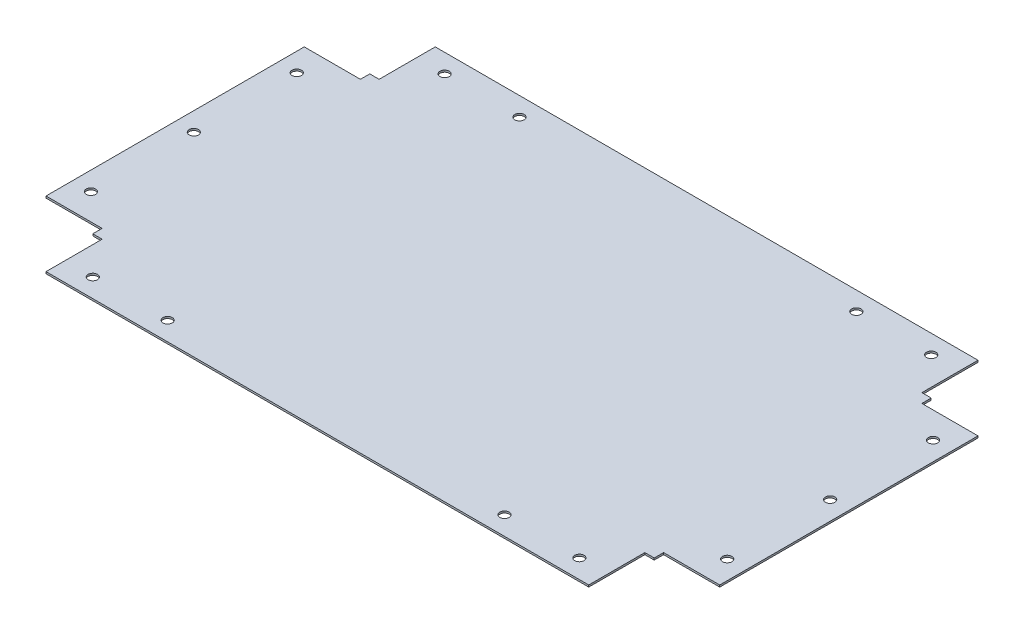
ISO-10303-21;
HEADER;
FILE_DESCRIPTION(('STEP AP214'),'2;1');
FILE_NAME('part.step','',(''),(''),'','','');
FILE_SCHEMA(('AUTOMOTIVE_DESIGN { 1 0 10303 214 1 1 1 1 }'));
ENDSEC;
DATA;
#1=APPLICATION_CONTEXT('core data for automotive mechanical design processes');
#2=APPLICATION_PROTOCOL_DEFINITION('international standard','automotive_design',2000,#1);
#3=PRODUCT_CONTEXT('',#1,'mechanical');
#4=PRODUCT('Part','Part','',(#3));
#5=PRODUCT_RELATED_PRODUCT_CATEGORY('part','',(#4));
#6=PRODUCT_DEFINITION_FORMATION('','',#4);
#7=PRODUCT_DEFINITION_CONTEXT('part definition',#1,'design');
#8=PRODUCT_DEFINITION('design','',#6,#7);
#9=PRODUCT_DEFINITION_SHAPE('','',#8);
#10=(LENGTH_UNIT() NAMED_UNIT(*) SI_UNIT(.MILLI.,.METRE.));
#11=(NAMED_UNIT(*) PLANE_ANGLE_UNIT() SI_UNIT($,.RADIAN.));
#12=(NAMED_UNIT(*) SI_UNIT($,.STERADIAN.) SOLID_ANGLE_UNIT());
#13=UNCERTAINTY_MEASURE_WITH_UNIT(LENGTH_MEASURE(1.E-05),#10,'distance_accuracy_value','');
#14=(GEOMETRIC_REPRESENTATION_CONTEXT(3) GLOBAL_UNCERTAINTY_ASSIGNED_CONTEXT((#13)) GLOBAL_UNIT_ASSIGNED_CONTEXT((#10,
#11,#12)) REPRESENTATION_CONTEXT('',''));
#15=CARTESIAN_POINT('',(0.,0.,0.));
#16=DIRECTION('',(0.,0.,1.));
#17=DIRECTION('',(1.,0.,0.));
#18=AXIS2_PLACEMENT_3D('',#15,#16,#17);
#19=CARTESIAN_POINT('',(0.,1.,0.));
#20=DIRECTION('',(0.,-1.,0.));
#21=DIRECTION('',(0.,0.,-1.));
#22=AXIS2_PLACEMENT_3D('',#19,#20,#21);
#23=PLANE('',#22);
#24=DIRECTION('',(1.,0.,0.));
#25=VECTOR('',#24,1.);
#26=CARTESIAN_POINT('',(5.,1.,0.));
#27=LINE('',#26,#25);
#28=CARTESIAN_POINT('',(0.,1.,0.));
#29=VERTEX_POINT('',#28);
#30=CARTESIAN_POINT('',(5.,1.,0.));
#31=VERTEX_POINT('',#30);
#32=EDGE_CURVE('E241',#29,#31,#27,.T.);
#33=ORIENTED_EDGE('',*,*,#32,.T.);
#34=DIRECTION('',(0.,0.,1.));
#35=VECTOR('',#34,1.);
#36=CARTESIAN_POINT('',(5.,1.,30.));
#37=LINE('',#36,#35);
#38=CARTESIAN_POINT('',(5.,1.,30.));
#39=VERTEX_POINT('',#38);
#40=EDGE_CURVE('E129',#31,#39,#37,.T.);
#41=ORIENTED_EDGE('',*,*,#40,.T.);
#42=DIRECTION('',(1.,0.,0.));
#43=VECTOR('',#42,1.);
#44=CARTESIAN_POINT('',(295.,1.,30.));
#45=LINE('',#44,#43);
#46=CARTESIAN_POINT('',(295.,1.,30.));
#47=VERTEX_POINT('',#46);
#48=EDGE_CURVE('E292',#39,#47,#45,.T.);
#49=ORIENTED_EDGE('',*,*,#48,.T.);
#50=DIRECTION('',(0.,0.,-1.));
#51=VECTOR('',#50,1.);
#52=CARTESIAN_POINT('',(295.,1.,0.));
#53=LINE('',#52,#51);
#54=CARTESIAN_POINT('',(295.,1.,0.));
#55=VERTEX_POINT('',#54);
#56=EDGE_CURVE('E311',#47,#55,#53,.T.);
#57=ORIENTED_EDGE('',*,*,#56,.T.);
#58=DIRECTION('',(1.,0.,0.));
#59=VECTOR('',#58,1.);
#60=CARTESIAN_POINT('',(300.,1.,0.));
#61=LINE('',#60,#59);
#62=CARTESIAN_POINT('',(300.,1.,0.));
#63=VERTEX_POINT('',#62);
#64=EDGE_CURVE('E308',#55,#63,#61,.T.);
#65=ORIENTED_EDGE('',*,*,#64,.T.);
#66=DIRECTION('',(0.,0.,-1.));
#67=VECTOR('',#66,1.);
#68=CARTESIAN_POINT('',(300.,1.,-5.));
#69=LINE('',#68,#67);
#70=CARTESIAN_POINT('',(300.,1.,-5.));
#71=VERTEX_POINT('',#70);
#72=EDGE_CURVE('E310',#63,#71,#69,.T.);
#73=ORIENTED_EDGE('',*,*,#72,.T.);
#74=DIRECTION('',(1.,0.,0.));
#75=VECTOR('',#74,1.);
#76=CARTESIAN_POINT('',(330.,1.,-5.));
#77=LINE('',#76,#75);
#78=CARTESIAN_POINT('',(330.,1.,-5.));
#79=VERTEX_POINT('',#78);
#80=EDGE_CURVE('E313',#71,#79,#77,.T.);
#81=ORIENTED_EDGE('',*,*,#80,.T.);
#82=DIRECTION('',(0.,0.,-1.));
#83=VECTOR('',#82,1.);
#84=CARTESIAN_POINT('',(330.,1.,-143.));
#85=LINE('',#84,#83);
#86=CARTESIAN_POINT('',(330.,1.,-143.));
#87=VERTEX_POINT('',#86);
#88=EDGE_CURVE('E319',#79,#87,#85,.T.);
#89=ORIENTED_EDGE('',*,*,#88,.T.);
#90=DIRECTION('',(-1.,0.,0.));
#91=VECTOR('',#90,1.);
#92=CARTESIAN_POINT('',(300.,1.,-143.));
#93=LINE('',#92,#91);
#94=CARTESIAN_POINT('',(300.,1.,-143.));
#95=VERTEX_POINT('',#94);
#96=EDGE_CURVE('E321',#87,#95,#93,.T.);
#97=ORIENTED_EDGE('',*,*,#96,.T.);
#98=DIRECTION('',(0.,0.,-1.));
#99=VECTOR('',#98,1.);
#100=CARTESIAN_POINT('',(300.,1.,-148.));
#101=LINE('',#100,#99);
#102=CARTESIAN_POINT('',(300.,1.,-148.));
#103=VERTEX_POINT('',#102);
#104=EDGE_CURVE('E323',#95,#103,#101,.T.);
#105=ORIENTED_EDGE('',*,*,#104,.T.);
#106=DIRECTION('',(-1.,0.,0.));
#107=VECTOR('',#106,1.);
#108=CARTESIAN_POINT('',(295.,1.,-148.));
#109=LINE('',#108,#107);
#110=CARTESIAN_POINT('',(295.,1.,-148.));
#111=VERTEX_POINT('',#110);
#112=EDGE_CURVE('E325',#103,#111,#109,.T.);
#113=ORIENTED_EDGE('',*,*,#112,.T.);
#114=DIRECTION('',(0.,0.,-1.));
#115=VECTOR('',#114,1.);
#116=CARTESIAN_POINT('',(295.,1.,-178.));
#117=LINE('',#116,#115);
#118=CARTESIAN_POINT('',(295.,1.,-178.));
#119=VERTEX_POINT('',#118);
#120=EDGE_CURVE('E327',#111,#119,#117,.T.);
#121=ORIENTED_EDGE('',*,*,#120,.T.);
#122=DIRECTION('',(-1.,0.,0.));
#123=VECTOR('',#122,1.);
#124=CARTESIAN_POINT('',(5.,1.,-178.));
#125=LINE('',#124,#123);
#126=CARTESIAN_POINT('',(5.,1.,-178.));
#127=VERTEX_POINT('',#126);
#128=EDGE_CURVE('E329',#119,#127,#125,.T.);
#129=ORIENTED_EDGE('',*,*,#128,.T.);
#130=DIRECTION('',(0.,0.,1.));
#131=VECTOR('',#130,1.);
#132=CARTESIAN_POINT('',(5.,1.,-148.));
#133=LINE('',#132,#131);
#134=CARTESIAN_POINT('',(5.,1.,-148.));
#135=VERTEX_POINT('',#134);
#136=EDGE_CURVE('E331',#127,#135,#133,.T.);
#137=ORIENTED_EDGE('',*,*,#136,.T.);
#138=DIRECTION('',(-1.,0.,0.));
#139=VECTOR('',#138,1.);
#140=CARTESIAN_POINT('',(0.,1.,-148.));
#141=LINE('',#140,#139);
#142=CARTESIAN_POINT('',(0.,1.,-148.));
#143=VERTEX_POINT('',#142);
#144=EDGE_CURVE('E333',#135,#143,#141,.T.);
#145=ORIENTED_EDGE('',*,*,#144,.T.);
#146=DIRECTION('',(0.,0.,1.));
#147=VECTOR('',#146,1.);
#148=CARTESIAN_POINT('',(0.,1.,-143.));
#149=LINE('',#148,#147);
#150=CARTESIAN_POINT('',(0.,1.,-143.));
#151=VERTEX_POINT('',#150);
#152=EDGE_CURVE('E335',#143,#151,#149,.T.);
#153=ORIENTED_EDGE('',*,*,#152,.T.);
#154=DIRECTION('',(-1.,0.,0.));
#155=VECTOR('',#154,1.);
#156=CARTESIAN_POINT('',(-30.,1.,-143.));
#157=LINE('',#156,#155);
#158=CARTESIAN_POINT('',(-30.,1.,-143.));
#159=VERTEX_POINT('',#158);
#160=EDGE_CURVE('E184',#151,#159,#157,.T.);
#161=ORIENTED_EDGE('',*,*,#160,.T.);
#162=DIRECTION('',(0.,0.,1.));
#163=VECTOR('',#162,1.);
#164=CARTESIAN_POINT('',(-30.,1.,-5.));
#165=LINE('',#164,#163);
#166=CARTESIAN_POINT('',(-30.,1.,-5.));
#167=VERTEX_POINT('',#166);
#168=EDGE_CURVE('E178',#159,#167,#165,.T.);
#169=ORIENTED_EDGE('',*,*,#168,.T.);
#170=DIRECTION('',(1.,0.,0.));
#171=VECTOR('',#170,1.);
#172=CARTESIAN_POINT('',(0.,1.,-5.));
#173=LINE('',#172,#171);
#174=CARTESIAN_POINT('',(0.,1.,-5.));
#175=VERTEX_POINT('',#174);
#176=EDGE_CURVE('E182',#167,#175,#173,.T.);
#177=ORIENTED_EDGE('',*,*,#176,.T.);
#178=DIRECTION('',(0.,0.,1.));
#179=VECTOR('',#178,1.);
#180=CARTESIAN_POINT('',(0.,1.,0.));
#181=LINE('',#180,#179);
#182=EDGE_CURVE('E50',#175,#29,#181,.T.);
#183=ORIENTED_EDGE('',*,*,#182,.T.);
#184=EDGE_LOOP('',(#33,#41,#49,#57,#65,#73,#81,#89,#97,#105,#113,#121,#129,#137,#145,#153,#161,
#169,#177,#183));
#185=FACE_BOUND('',#184,.T.);
#186=CARTESIAN_POINT('',(20.,1.,20.));
#187=DIRECTION('',(0.,1.,0.));
#188=DIRECTION('',(0.,0.,1.));
#189=AXIS2_PLACEMENT_3D('',#186,#187,#188);
#190=CIRCLE('',#189,2.5);
#191=CARTESIAN_POINT('',(20.,1.,22.5));
#192=VERTEX_POINT('',#191);
#193=EDGE_CURVE('E206',#192,#192,#190,.T.);
#194=ORIENTED_EDGE('',*,*,#193,.F.);
#195=EDGE_LOOP('',(#194));
#196=FACE_BOUND('',#195,.T.);
#197=CARTESIAN_POINT('',(60.,1.,20.));
#198=DIRECTION('',(0.,1.,0.));
#199=DIRECTION('',(0.,0.,1.));
#200=AXIS2_PLACEMENT_3D('',#197,#198,#199);
#201=CIRCLE('',#200,2.5);
#202=CARTESIAN_POINT('',(60.,1.,22.5));
#203=VERTEX_POINT('',#202);
#204=EDGE_CURVE('E499',#203,#203,#201,.T.);
#205=ORIENTED_EDGE('',*,*,#204,.F.);
#206=EDGE_LOOP('',(#205));
#207=FACE_BOUND('',#206,.T.);
#208=CARTESIAN_POINT('',(280.,1.,20.));
#209=DIRECTION('',(0.,1.,0.));
#210=DIRECTION('',(0.,0.,1.));
#211=AXIS2_PLACEMENT_3D('',#208,#209,#210);
#212=CIRCLE('',#211,2.50000000000002);
#213=CARTESIAN_POINT('',(280.,1.,22.5));
#214=VERTEX_POINT('',#213);
#215=EDGE_CURVE('E493',#214,#214,#212,.T.);
#216=ORIENTED_EDGE('',*,*,#215,.F.);
#217=EDGE_LOOP('',(#216));
#218=FACE_BOUND('',#217,.T.);
#219=CARTESIAN_POINT('',(240.,1.,20.));
#220=DIRECTION('',(0.,1.,0.));
#221=DIRECTION('',(0.,0.,1.));
#222=AXIS2_PLACEMENT_3D('',#219,#220,#221);
#223=CIRCLE('',#222,2.5);
#224=CARTESIAN_POINT('',(240.,1.,22.5));
#225=VERTEX_POINT('',#224);
#226=EDGE_CURVE('E487',#225,#225,#223,.T.);
#227=ORIENTED_EDGE('',*,*,#226,.F.);
#228=EDGE_LOOP('',(#227));
#229=FACE_BOUND('',#228,.T.);
#230=CARTESIAN_POINT('',(320.,1.,-19.));
#231=DIRECTION('',(0.,1.,0.));
#232=DIRECTION('',(0.,0.,1.));
#233=AXIS2_PLACEMENT_3D('',#230,#231,#232);
#234=CIRCLE('',#233,2.50000000000002);
#235=CARTESIAN_POINT('',(320.,1.,-16.5));
#236=VERTEX_POINT('',#235);
#237=EDGE_CURVE('E481',#236,#236,#234,.T.);
#238=ORIENTED_EDGE('',*,*,#237,.F.);
#239=EDGE_LOOP('',(#238));
#240=FACE_BOUND('',#239,.T.);
#241=CARTESIAN_POINT('',(320.,1.,-129.));
#242=DIRECTION('',(0.,1.,0.));
#243=DIRECTION('',(0.,0.,1.));
#244=AXIS2_PLACEMENT_3D('',#241,#242,#243);
#245=CIRCLE('',#244,2.50000000000002);
#246=CARTESIAN_POINT('',(320.,1.,-126.5));
#247=VERTEX_POINT('',#246);
#248=EDGE_CURVE('E475',#247,#247,#245,.T.);
#249=ORIENTED_EDGE('',*,*,#248,.F.);
#250=EDGE_LOOP('',(#249));
#251=FACE_BOUND('',#250,.T.);
#252=CARTESIAN_POINT('',(280.,1.,-168.));
#253=DIRECTION('',(0.,1.,0.));
#254=DIRECTION('',(0.,0.,1.));
#255=AXIS2_PLACEMENT_3D('',#252,#253,#254);
#256=CIRCLE('',#255,2.50000000000002);
#257=CARTESIAN_POINT('',(280.,1.,-165.5));
#258=VERTEX_POINT('',#257);
#259=EDGE_CURVE('E469',#258,#258,#256,.T.);
#260=ORIENTED_EDGE('',*,*,#259,.F.);
#261=EDGE_LOOP('',(#260));
#262=FACE_BOUND('',#261,.T.);
#263=CARTESIAN_POINT('',(240.,1.,-168.));
#264=DIRECTION('',(0.,1.,0.));
#265=DIRECTION('',(0.,0.,1.));
#266=AXIS2_PLACEMENT_3D('',#263,#264,#265);
#267=CIRCLE('',#266,2.50000000000002);
#268=CARTESIAN_POINT('',(240.,1.,-165.5));
#269=VERTEX_POINT('',#268);
#270=EDGE_CURVE('E463',#269,#269,#267,.T.);
#271=ORIENTED_EDGE('',*,*,#270,.F.);
#272=EDGE_LOOP('',(#271));
#273=FACE_BOUND('',#272,.T.);
#274=CARTESIAN_POINT('',(60.,1.,-168.));
#275=DIRECTION('',(0.,1.,0.));
#276=DIRECTION('',(0.,0.,1.));
#277=AXIS2_PLACEMENT_3D('',#274,#275,#276);
#278=CIRCLE('',#277,2.5);
#279=CARTESIAN_POINT('',(60.,1.,-165.5));
#280=VERTEX_POINT('',#279);
#281=EDGE_CURVE('E457',#280,#280,#278,.T.);
#282=ORIENTED_EDGE('',*,*,#281,.F.);
#283=EDGE_LOOP('',(#282));
#284=FACE_BOUND('',#283,.T.);
#285=CARTESIAN_POINT('',(20.,1.,-168.));
#286=DIRECTION('',(0.,1.,0.));
#287=DIRECTION('',(0.,0.,1.));
#288=AXIS2_PLACEMENT_3D('',#285,#286,#287);
#289=CIRCLE('',#288,2.5);
#290=CARTESIAN_POINT('',(20.,1.,-165.5));
#291=VERTEX_POINT('',#290);
#292=EDGE_CURVE('E451',#291,#291,#289,.T.);
#293=ORIENTED_EDGE('',*,*,#292,.F.);
#294=EDGE_LOOP('',(#293));
#295=FACE_BOUND('',#294,.T.);
#296=CARTESIAN_POINT('',(-20.,1.,-129.));
#297=DIRECTION('',(0.,1.,0.));
#298=DIRECTION('',(0.,0.,1.));
#299=AXIS2_PLACEMENT_3D('',#296,#297,#298);
#300=CIRCLE('',#299,2.5);
#301=CARTESIAN_POINT('',(-20.,1.,-126.5));
#302=VERTEX_POINT('',#301);
#303=EDGE_CURVE('E445',#302,#302,#300,.T.);
#304=ORIENTED_EDGE('',*,*,#303,.F.);
#305=EDGE_LOOP('',(#304));
#306=FACE_BOUND('',#305,.T.);
#307=CARTESIAN_POINT('',(-20.,1.,-19.));
#308=DIRECTION('',(0.,1.,0.));
#309=DIRECTION('',(0.,0.,1.));
#310=AXIS2_PLACEMENT_3D('',#307,#308,#309);
#311=CIRCLE('',#310,2.5);
#312=CARTESIAN_POINT('',(-20.,1.,-16.5));
#313=VERTEX_POINT('',#312);
#314=EDGE_CURVE('E439',#313,#313,#311,.T.);
#315=ORIENTED_EDGE('',*,*,#314,.F.);
#316=EDGE_LOOP('',(#315));
#317=FACE_BOUND('',#316,.T.);
#318=CARTESIAN_POINT('',(-20.,1.,-74.));
#319=DIRECTION('',(0.,1.,0.));
#320=DIRECTION('',(0.,0.,1.));
#321=AXIS2_PLACEMENT_3D('',#318,#319,#320);
#322=CIRCLE('',#321,2.5);
#323=CARTESIAN_POINT('',(-20.,1.,-71.5));
#324=VERTEX_POINT('',#323);
#325=EDGE_CURVE('E433',#324,#324,#322,.T.);
#326=ORIENTED_EDGE('',*,*,#325,.F.);
#327=EDGE_LOOP('',(#326));
#328=FACE_BOUND('',#327,.T.);
#329=CARTESIAN_POINT('',(320.,1.,-74.));
#330=DIRECTION('',(0.,1.,0.));
#331=DIRECTION('',(0.,0.,1.));
#332=AXIS2_PLACEMENT_3D('',#329,#330,#331);
#333=CIRCLE('',#332,2.50000000000002);
#334=CARTESIAN_POINT('',(320.,1.,-71.5));
#335=VERTEX_POINT('',#334);
#336=EDGE_CURVE('E424',#335,#335,#333,.T.);
#337=ORIENTED_EDGE('',*,*,#336,.F.);
#338=EDGE_LOOP('',(#337));
#339=FACE_BOUND('',#338,.T.);
#340=ADVANCED_FACE('F33',(#185,#196,#207,#218,#229,#240,#251,#262,#273,#284,#295,#306,#317,#328,
#339),#23,.F.);
#341=CARTESIAN_POINT('',(0.,0.,0.));
#342=DIRECTION('',(0.,-1.,0.));
#343=DIRECTION('',(0.,0.,-1.));
#344=AXIS2_PLACEMENT_3D('',#341,#342,#343);
#345=PLANE('',#344);
#346=CARTESIAN_POINT('',(-20.,0.,-74.));
#347=DIRECTION('',(0.,1.,0.));
#348=DIRECTION('',(0.,0.,1.));
#349=AXIS2_PLACEMENT_3D('',#346,#347,#348);
#350=CIRCLE('',#349,2.5);
#351=CARTESIAN_POINT('',(-20.,0.,-71.5));
#352=VERTEX_POINT('',#351);
#353=EDGE_CURVE('E430',#352,#352,#350,.T.);
#354=ORIENTED_EDGE('',*,*,#353,.T.);
#355=EDGE_LOOP('',(#354));
#356=FACE_BOUND('',#355,.T.);
#357=CARTESIAN_POINT('',(-20.,0.,-129.));
#358=DIRECTION('',(0.,1.,0.));
#359=DIRECTION('',(0.,0.,1.));
#360=AXIS2_PLACEMENT_3D('',#357,#358,#359);
#361=CIRCLE('',#360,2.5);
#362=CARTESIAN_POINT('',(-20.,0.,-126.5));
#363=VERTEX_POINT('',#362);
#364=EDGE_CURVE('E442',#363,#363,#361,.T.);
#365=ORIENTED_EDGE('',*,*,#364,.T.);
#366=EDGE_LOOP('',(#365));
#367=FACE_BOUND('',#366,.T.);
#368=CARTESIAN_POINT('',(60.,0.,-168.));
#369=DIRECTION('',(0.,1.,0.));
#370=DIRECTION('',(0.,0.,1.));
#371=AXIS2_PLACEMENT_3D('',#368,#369,#370);
#372=CIRCLE('',#371,2.5);
#373=CARTESIAN_POINT('',(60.,0.,-165.5));
#374=VERTEX_POINT('',#373);
#375=EDGE_CURVE('E454',#374,#374,#372,.T.);
#376=ORIENTED_EDGE('',*,*,#375,.T.);
#377=EDGE_LOOP('',(#376));
#378=FACE_BOUND('',#377,.T.);
#379=CARTESIAN_POINT('',(280.,0.,-168.));
#380=DIRECTION('',(0.,1.,0.));
#381=DIRECTION('',(0.,0.,1.));
#382=AXIS2_PLACEMENT_3D('',#379,#380,#381);
#383=CIRCLE('',#382,2.50000000000002);
#384=CARTESIAN_POINT('',(280.,0.,-165.5));
#385=VERTEX_POINT('',#384);
#386=EDGE_CURVE('E466',#385,#385,#383,.T.);
#387=ORIENTED_EDGE('',*,*,#386,.T.);
#388=EDGE_LOOP('',(#387));
#389=FACE_BOUND('',#388,.T.);
#390=CARTESIAN_POINT('',(320.,0.,-19.));
#391=DIRECTION('',(0.,1.,0.));
#392=DIRECTION('',(0.,0.,1.));
#393=AXIS2_PLACEMENT_3D('',#390,#391,#392);
#394=CIRCLE('',#393,2.50000000000002);
#395=CARTESIAN_POINT('',(320.,0.,-16.5));
#396=VERTEX_POINT('',#395);
#397=EDGE_CURVE('E478',#396,#396,#394,.T.);
#398=ORIENTED_EDGE('',*,*,#397,.T.);
#399=EDGE_LOOP('',(#398));
#400=FACE_BOUND('',#399,.T.);
#401=CARTESIAN_POINT('',(280.,0.,20.));
#402=DIRECTION('',(0.,1.,0.));
#403=DIRECTION('',(0.,0.,1.));
#404=AXIS2_PLACEMENT_3D('',#401,#402,#403);
#405=CIRCLE('',#404,2.50000000000002);
#406=CARTESIAN_POINT('',(280.,0.,22.5));
#407=VERTEX_POINT('',#406);
#408=EDGE_CURVE('E490',#407,#407,#405,.T.);
#409=ORIENTED_EDGE('',*,*,#408,.T.);
#410=EDGE_LOOP('',(#409));
#411=FACE_BOUND('',#410,.T.);
#412=CARTESIAN_POINT('',(20.,0.,20.));
#413=DIRECTION('',(0.,1.,0.));
#414=DIRECTION('',(0.,0.,1.));
#415=AXIS2_PLACEMENT_3D('',#412,#413,#414);
#416=CIRCLE('',#415,2.5);
#417=CARTESIAN_POINT('',(20.,0.,22.5));
#418=VERTEX_POINT('',#417);
#419=EDGE_CURVE('E502',#418,#418,#416,.T.);
#420=ORIENTED_EDGE('',*,*,#419,.T.);
#421=EDGE_LOOP('',(#420));
#422=FACE_BOUND('',#421,.T.);
#423=DIRECTION('',(1.,0.,0.));
#424=VECTOR('',#423,1.);
#425=CARTESIAN_POINT('',(5.,0.,0.));
#426=LINE('',#425,#424);
#427=CARTESIAN_POINT('',(0.,0.,0.));
#428=VERTEX_POINT('',#427);
#429=CARTESIAN_POINT('',(5.,0.,0.));
#430=VERTEX_POINT('',#429);
#431=EDGE_CURVE('E202',#428,#430,#426,.T.);
#432=ORIENTED_EDGE('',*,*,#431,.F.);
#433=DIRECTION('',(0.,0.,1.));
#434=VECTOR('',#433,1.);
#435=CARTESIAN_POINT('',(0.,0.,0.));
#436=LINE('',#435,#434);
#437=CARTESIAN_POINT('',(0.,0.,-5.));
#438=VERTEX_POINT('',#437);
#439=EDGE_CURVE('E121',#438,#428,#436,.T.);
#440=ORIENTED_EDGE('',*,*,#439,.F.);
#441=DIRECTION('',(1.,0.,0.));
#442=VECTOR('',#441,1.);
#443=CARTESIAN_POINT('',(0.,0.,-5.));
#444=LINE('',#443,#442);
#445=CARTESIAN_POINT('',(-30.,0.,-5.));
#446=VERTEX_POINT('',#445);
#447=EDGE_CURVE('E115',#446,#438,#444,.T.);
#448=ORIENTED_EDGE('',*,*,#447,.F.);
#449=DIRECTION('',(0.,0.,1.));
#450=VECTOR('',#449,1.);
#451=CARTESIAN_POINT('',(-30.,0.,-5.));
#452=LINE('',#451,#450);
#453=CARTESIAN_POINT('',(-30.,0.,-143.));
#454=VERTEX_POINT('',#453);
#455=EDGE_CURVE('E192',#454,#446,#452,.T.);
#456=ORIENTED_EDGE('',*,*,#455,.F.);
#457=DIRECTION('',(-1.,0.,0.));
#458=VECTOR('',#457,1.);
#459=CARTESIAN_POINT('',(-30.,0.,-143.));
#460=LINE('',#459,#458);
#461=CARTESIAN_POINT('',(0.,0.,-143.));
#462=VERTEX_POINT('',#461);
#463=EDGE_CURVE('E236',#462,#454,#460,.T.);
#464=ORIENTED_EDGE('',*,*,#463,.F.);
#465=DIRECTION('',(0.,0.,1.));
#466=VECTOR('',#465,1.);
#467=CARTESIAN_POINT('',(0.,0.,-143.));
#468=LINE('',#467,#466);
#469=CARTESIAN_POINT('',(0.,0.,-148.));
#470=VERTEX_POINT('',#469);
#471=EDGE_CURVE('E234',#470,#462,#468,.T.);
#472=ORIENTED_EDGE('',*,*,#471,.F.);
#473=DIRECTION('',(-1.,0.,0.));
#474=VECTOR('',#473,1.);
#475=CARTESIAN_POINT('',(0.,0.,-148.));
#476=LINE('',#475,#474);
#477=CARTESIAN_POINT('',(5.,0.,-148.));
#478=VERTEX_POINT('',#477);
#479=EDGE_CURVE('E232',#478,#470,#476,.T.);
#480=ORIENTED_EDGE('',*,*,#479,.F.);
#481=DIRECTION('',(0.,0.,1.));
#482=VECTOR('',#481,1.);
#483=CARTESIAN_POINT('',(5.,0.,-148.));
#484=LINE('',#483,#482);
#485=CARTESIAN_POINT('',(5.,0.,-178.));
#486=VERTEX_POINT('',#485);
#487=EDGE_CURVE('E230',#486,#478,#484,.T.);
#488=ORIENTED_EDGE('',*,*,#487,.F.);
#489=DIRECTION('',(-1.,0.,0.));
#490=VECTOR('',#489,1.);
#491=CARTESIAN_POINT('',(5.,0.,-178.));
#492=LINE('',#491,#490);
#493=CARTESIAN_POINT('',(295.,0.,-178.));
#494=VERTEX_POINT('',#493);
#495=EDGE_CURVE('E228',#494,#486,#492,.T.);
#496=ORIENTED_EDGE('',*,*,#495,.F.);
#497=DIRECTION('',(0.,0.,-1.));
#498=VECTOR('',#497,1.);
#499=CARTESIAN_POINT('',(295.,0.,-178.));
#500=LINE('',#499,#498);
#501=CARTESIAN_POINT('',(295.,0.,-148.));
#502=VERTEX_POINT('',#501);
#503=EDGE_CURVE('E226',#502,#494,#500,.T.);
#504=ORIENTED_EDGE('',*,*,#503,.F.);
#505=DIRECTION('',(-1.,0.,0.));
#506=VECTOR('',#505,1.);
#507=CARTESIAN_POINT('',(295.,0.,-148.));
#508=LINE('',#507,#506);
#509=CARTESIAN_POINT('',(300.,0.,-148.));
#510=VERTEX_POINT('',#509);
#511=EDGE_CURVE('E224',#510,#502,#508,.T.);
#512=ORIENTED_EDGE('',*,*,#511,.F.);
#513=DIRECTION('',(0.,0.,-1.));
#514=VECTOR('',#513,1.);
#515=CARTESIAN_POINT('',(300.,0.,-148.));
#516=LINE('',#515,#514);
#517=CARTESIAN_POINT('',(300.,0.,-143.));
#518=VERTEX_POINT('',#517);
#519=EDGE_CURVE('E222',#518,#510,#516,.T.);
#520=ORIENTED_EDGE('',*,*,#519,.F.);
#521=DIRECTION('',(-1.,0.,0.));
#522=VECTOR('',#521,1.);
#523=CARTESIAN_POINT('',(300.,0.,-143.));
#524=LINE('',#523,#522);
#525=CARTESIAN_POINT('',(330.,0.,-143.));
#526=VERTEX_POINT('',#525);
#527=EDGE_CURVE('E220',#526,#518,#524,.T.);
#528=ORIENTED_EDGE('',*,*,#527,.F.);
#529=DIRECTION('',(0.,0.,-1.));
#530=VECTOR('',#529,1.);
#531=CARTESIAN_POINT('',(330.,0.,-143.));
#532=LINE('',#531,#530);
#533=CARTESIAN_POINT('',(330.,0.,-5.));
#534=VERTEX_POINT('',#533);
#535=EDGE_CURVE('E218',#534,#526,#532,.T.);
#536=ORIENTED_EDGE('',*,*,#535,.F.);
#537=DIRECTION('',(1.,0.,0.));
#538=VECTOR('',#537,1.);
#539=CARTESIAN_POINT('',(330.,0.,-5.));
#540=LINE('',#539,#538);
#541=CARTESIAN_POINT('',(300.,0.,-5.));
#542=VERTEX_POINT('',#541);
#543=EDGE_CURVE('E216',#542,#534,#540,.T.);
#544=ORIENTED_EDGE('',*,*,#543,.F.);
#545=DIRECTION('',(0.,0.,-1.));
#546=VECTOR('',#545,1.);
#547=CARTESIAN_POINT('',(300.,0.,-5.));
#548=LINE('',#547,#546);
#549=CARTESIAN_POINT('',(300.,0.,0.));
#550=VERTEX_POINT('',#549);
#551=EDGE_CURVE('E214',#550,#542,#548,.T.);
#552=ORIENTED_EDGE('',*,*,#551,.F.);
#553=DIRECTION('',(1.,0.,0.));
#554=VECTOR('',#553,1.);
#555=CARTESIAN_POINT('',(300.,0.,0.));
#556=LINE('',#555,#554);
#557=CARTESIAN_POINT('',(295.,0.,0.));
#558=VERTEX_POINT('',#557);
#559=EDGE_CURVE('E212',#558,#550,#556,.T.);
#560=ORIENTED_EDGE('',*,*,#559,.F.);
#561=DIRECTION('',(0.,0.,-1.));
#562=VECTOR('',#561,1.);
#563=CARTESIAN_POINT('',(295.,0.,0.));
#564=LINE('',#563,#562);
#565=CARTESIAN_POINT('',(295.,0.,30.));
#566=VERTEX_POINT('',#565);
#567=EDGE_CURVE('E210',#566,#558,#564,.T.);
#568=ORIENTED_EDGE('',*,*,#567,.F.);
#569=DIRECTION('',(1.,0.,0.));
#570=VECTOR('',#569,1.);
#571=CARTESIAN_POINT('',(295.,0.,30.));
#572=LINE('',#571,#570);
#573=CARTESIAN_POINT('',(5.,0.,30.));
#574=VERTEX_POINT('',#573);
#575=EDGE_CURVE('E208',#574,#566,#572,.T.);
#576=ORIENTED_EDGE('',*,*,#575,.F.);
#577=DIRECTION('',(0.,0.,1.));
#578=VECTOR('',#577,1.);
#579=CARTESIAN_POINT('',(5.,0.,30.));
#580=LINE('',#579,#578);
#581=EDGE_CURVE('E205',#430,#574,#580,.T.);
#582=ORIENTED_EDGE('',*,*,#581,.F.);
#583=EDGE_LOOP('',(#432,#440,#448,#456,#464,#472,#480,#488,#496,#504,#512,#520,#528,#536,#544,
#552,#560,#568,#576,#582));
#584=FACE_BOUND('',#583,.T.);
#585=CARTESIAN_POINT('',(60.,0.,20.));
#586=DIRECTION('',(0.,1.,0.));
#587=DIRECTION('',(0.,0.,1.));
#588=AXIS2_PLACEMENT_3D('',#585,#586,#587);
#589=CIRCLE('',#588,2.5);
#590=CARTESIAN_POINT('',(60.,0.,22.5));
#591=VERTEX_POINT('',#590);
#592=EDGE_CURVE('E496',#591,#591,#589,.T.);
#593=ORIENTED_EDGE('',*,*,#592,.T.);
#594=EDGE_LOOP('',(#593));
#595=FACE_BOUND('',#594,.T.);
#596=CARTESIAN_POINT('',(240.,0.,20.));
#597=DIRECTION('',(0.,1.,0.));
#598=DIRECTION('',(0.,0.,1.));
#599=AXIS2_PLACEMENT_3D('',#596,#597,#598);
#600=CIRCLE('',#599,2.5);
#601=CARTESIAN_POINT('',(240.,0.,22.5));
#602=VERTEX_POINT('',#601);
#603=EDGE_CURVE('E484',#602,#602,#600,.T.);
#604=ORIENTED_EDGE('',*,*,#603,.T.);
#605=EDGE_LOOP('',(#604));
#606=FACE_BOUND('',#605,.T.);
#607=CARTESIAN_POINT('',(320.,0.,-129.));
#608=DIRECTION('',(0.,1.,0.));
#609=DIRECTION('',(0.,0.,1.));
#610=AXIS2_PLACEMENT_3D('',#607,#608,#609);
#611=CIRCLE('',#610,2.50000000000002);
#612=CARTESIAN_POINT('',(320.,0.,-126.5));
#613=VERTEX_POINT('',#612);
#614=EDGE_CURVE('E472',#613,#613,#611,.T.);
#615=ORIENTED_EDGE('',*,*,#614,.T.);
#616=EDGE_LOOP('',(#615));
#617=FACE_BOUND('',#616,.T.);
#618=CARTESIAN_POINT('',(240.,0.,-168.));
#619=DIRECTION('',(0.,1.,0.));
#620=DIRECTION('',(0.,0.,1.));
#621=AXIS2_PLACEMENT_3D('',#618,#619,#620);
#622=CIRCLE('',#621,2.50000000000002);
#623=CARTESIAN_POINT('',(240.,0.,-165.5));
#624=VERTEX_POINT('',#623);
#625=EDGE_CURVE('E460',#624,#624,#622,.T.);
#626=ORIENTED_EDGE('',*,*,#625,.T.);
#627=EDGE_LOOP('',(#626));
#628=FACE_BOUND('',#627,.T.);
#629=CARTESIAN_POINT('',(20.,0.,-168.));
#630=DIRECTION('',(0.,1.,0.));
#631=DIRECTION('',(0.,0.,1.));
#632=AXIS2_PLACEMENT_3D('',#629,#630,#631);
#633=CIRCLE('',#632,2.5);
#634=CARTESIAN_POINT('',(20.,0.,-165.5));
#635=VERTEX_POINT('',#634);
#636=EDGE_CURVE('E448',#635,#635,#633,.T.);
#637=ORIENTED_EDGE('',*,*,#636,.T.);
#638=EDGE_LOOP('',(#637));
#639=FACE_BOUND('',#638,.T.);
#640=CARTESIAN_POINT('',(-20.,0.,-19.));
#641=DIRECTION('',(0.,1.,0.));
#642=DIRECTION('',(0.,0.,1.));
#643=AXIS2_PLACEMENT_3D('',#640,#641,#642);
#644=CIRCLE('',#643,2.5);
#645=CARTESIAN_POINT('',(-20.,0.,-16.5));
#646=VERTEX_POINT('',#645);
#647=EDGE_CURVE('E436',#646,#646,#644,.T.);
#648=ORIENTED_EDGE('',*,*,#647,.T.);
#649=EDGE_LOOP('',(#648));
#650=FACE_BOUND('',#649,.T.);
#651=CARTESIAN_POINT('',(320.,0.,-74.));
#652=DIRECTION('',(0.,1.,0.));
#653=DIRECTION('',(0.,0.,1.));
#654=AXIS2_PLACEMENT_3D('',#651,#652,#653);
#655=CIRCLE('',#654,2.50000000000002);
#656=CARTESIAN_POINT('',(320.,0.,-71.5));
#657=VERTEX_POINT('',#656);
#658=EDGE_CURVE('E427',#657,#657,#655,.T.);
#659=ORIENTED_EDGE('',*,*,#658,.T.);
#660=EDGE_LOOP('',(#659));
#661=FACE_BOUND('',#660,.T.);
#662=ADVANCED_FACE('F296',(#356,#367,#378,#389,#400,#411,#422,#584,#595,#606,#617,#628,#639,
#650,#661),#345,.T.);
#663=CARTESIAN_POINT('',(5.,1.,0.));
#664=DIRECTION('',(0.,0.,-1.));
#665=DIRECTION('',(-1.,0.,0.));
#666=AXIS2_PLACEMENT_3D('',#663,#664,#665);
#667=PLANE('',#666);
#668=ORIENTED_EDGE('',*,*,#431,.T.);
#669=DIRECTION('',(0.,-1.,0.));
#670=VECTOR('',#669,1.);
#671=CARTESIAN_POINT('',(5.,1.,0.));
#672=LINE('',#671,#670);
#673=EDGE_CURVE('E11',#31,#430,#672,.T.);
#674=ORIENTED_EDGE('',*,*,#673,.F.);
#675=ORIENTED_EDGE('',*,*,#32,.F.);
#676=DIRECTION('',(0.,-1.,0.));
#677=VECTOR('',#676,1.);
#678=CARTESIAN_POINT('',(0.,1.,0.));
#679=LINE('',#678,#677);
#680=EDGE_CURVE('E198',#29,#428,#679,.T.);
#681=ORIENTED_EDGE('',*,*,#680,.T.);
#682=EDGE_LOOP('',(#668,#674,#675,#681));
#683=FACE_BOUND('',#682,.T.);
#684=ADVANCED_FACE('F35',(#683),#667,.F.);
#685=CARTESIAN_POINT('',(5.,1.,30.));
#686=DIRECTION('',(1.,0.,0.));
#687=DIRECTION('',(0.,0.,-1.));
#688=AXIS2_PLACEMENT_3D('',#685,#686,#687);
#689=PLANE('',#688);
#690=ORIENTED_EDGE('',*,*,#581,.T.);
#691=DIRECTION('',(0.,-1.,0.));
#692=VECTOR('',#691,1.);
#693=CARTESIAN_POINT('',(5.,1.,30.));
#694=LINE('',#693,#692);
#695=EDGE_CURVE('E42',#39,#574,#694,.T.);
#696=ORIENTED_EDGE('',*,*,#695,.F.);
#697=ORIENTED_EDGE('',*,*,#40,.F.);
#698=ORIENTED_EDGE('',*,*,#673,.T.);
#699=EDGE_LOOP('',(#690,#696,#697,#698));
#700=FACE_BOUND('',#699,.T.);
#701=ADVANCED_FACE('F784',(#700),#689,.F.);
#702=CARTESIAN_POINT('',(295.,1.,30.));
#703=DIRECTION('',(0.,0.,-1.));
#704=DIRECTION('',(-1.,0.,0.));
#705=AXIS2_PLACEMENT_3D('',#702,#703,#704);
#706=PLANE('',#705);
#707=ORIENTED_EDGE('',*,*,#575,.T.);
#708=DIRECTION('',(0.,-1.,0.));
#709=VECTOR('',#708,1.);
#710=CARTESIAN_POINT('',(295.,1.,30.));
#711=LINE('',#710,#709);
#712=EDGE_CURVE('E284',#47,#566,#711,.T.);
#713=ORIENTED_EDGE('',*,*,#712,.F.);
#714=ORIENTED_EDGE('',*,*,#48,.F.);
#715=ORIENTED_EDGE('',*,*,#695,.T.);
#716=EDGE_LOOP('',(#707,#713,#714,#715));
#717=FACE_BOUND('',#716,.T.);
#718=ADVANCED_FACE('F290',(#717),#706,.F.);
#719=CARTESIAN_POINT('',(295.,1.,0.));
#720=DIRECTION('',(-1.,0.,0.));
#721=DIRECTION('',(0.,0.,1.));
#722=AXIS2_PLACEMENT_3D('',#719,#720,#721);
#723=PLANE('',#722);
#724=ORIENTED_EDGE('',*,*,#567,.T.);
#725=DIRECTION('',(0.,-1.,0.));
#726=VECTOR('',#725,1.);
#727=CARTESIAN_POINT('',(295.,1.,0.));
#728=LINE('',#727,#726);
#729=EDGE_CURVE('E281',#55,#558,#728,.T.);
#730=ORIENTED_EDGE('',*,*,#729,.F.);
#731=ORIENTED_EDGE('',*,*,#56,.F.);
#732=ORIENTED_EDGE('',*,*,#712,.T.);
#733=EDGE_LOOP('',(#724,#730,#731,#732));
#734=FACE_BOUND('',#733,.T.);
#735=ADVANCED_FACE('F302',(#734),#723,.F.);
#736=CARTESIAN_POINT('',(300.,1.,0.));
#737=DIRECTION('',(0.,0.,-1.));
#738=DIRECTION('',(-1.,0.,0.));
#739=AXIS2_PLACEMENT_3D('',#736,#737,#738);
#740=PLANE('',#739);
#741=ORIENTED_EDGE('',*,*,#559,.T.);
#742=DIRECTION('',(0.,-1.,0.));
#743=VECTOR('',#742,1.);
#744=CARTESIAN_POINT('',(300.,1.,0.));
#745=LINE('',#744,#743);
#746=EDGE_CURVE('E278',#63,#550,#745,.T.);
#747=ORIENTED_EDGE('',*,*,#746,.F.);
#748=ORIENTED_EDGE('',*,*,#64,.F.);
#749=ORIENTED_EDGE('',*,*,#729,.T.);
#750=EDGE_LOOP('',(#741,#747,#748,#749));
#751=FACE_BOUND('',#750,.T.);
#752=ADVANCED_FACE('F306',(#751),#740,.F.);
#753=CARTESIAN_POINT('',(300.,1.,-5.));
#754=DIRECTION('',(-1.,0.,0.));
#755=DIRECTION('',(0.,0.,1.));
#756=AXIS2_PLACEMENT_3D('',#753,#754,#755);
#757=PLANE('',#756);
#758=ORIENTED_EDGE('',*,*,#551,.T.);
#759=DIRECTION('',(0.,-1.,0.));
#760=VECTOR('',#759,1.);
#761=CARTESIAN_POINT('',(300.,1.,-5.));
#762=LINE('',#761,#760);
#763=EDGE_CURVE('E275',#71,#542,#762,.T.);
#764=ORIENTED_EDGE('',*,*,#763,.F.);
#765=ORIENTED_EDGE('',*,*,#72,.F.);
#766=ORIENTED_EDGE('',*,*,#746,.T.);
#767=EDGE_LOOP('',(#758,#764,#765,#766));
#768=FACE_BOUND('',#767,.T.);
#769=ADVANCED_FACE('F749',(#768),#757,.F.);
#770=CARTESIAN_POINT('',(330.,1.,-5.));
#771=DIRECTION('',(0.,0.,-1.));
#772=DIRECTION('',(-1.,0.,0.));
#773=AXIS2_PLACEMENT_3D('',#770,#771,#772);
#774=PLANE('',#773);
#775=ORIENTED_EDGE('',*,*,#543,.T.);
#776=DIRECTION('',(0.,-1.,0.));
#777=VECTOR('',#776,1.);
#778=CARTESIAN_POINT('',(330.,1.,-5.));
#779=LINE('',#778,#777);
#780=EDGE_CURVE('E272',#79,#534,#779,.T.);
#781=ORIENTED_EDGE('',*,*,#780,.F.);
#782=ORIENTED_EDGE('',*,*,#80,.F.);
#783=ORIENTED_EDGE('',*,*,#763,.T.);
#784=EDGE_LOOP('',(#775,#781,#782,#783));
#785=FACE_BOUND('',#784,.T.);
#786=ADVANCED_FACE('F739',(#785),#774,.F.);
#787=CARTESIAN_POINT('',(330.,1.,-143.));
#788=DIRECTION('',(-1.,0.,0.));
#789=DIRECTION('',(0.,0.,1.));
#790=AXIS2_PLACEMENT_3D('',#787,#788,#789);
#791=PLANE('',#790);
#792=ORIENTED_EDGE('',*,*,#535,.T.);
#793=DIRECTION('',(0.,-1.,0.));
#794=VECTOR('',#793,1.);
#795=CARTESIAN_POINT('',(330.,1.,-143.));
#796=LINE('',#795,#794);
#797=EDGE_CURVE('E269',#87,#526,#796,.T.);
#798=ORIENTED_EDGE('',*,*,#797,.F.);
#799=ORIENTED_EDGE('',*,*,#88,.F.);
#800=ORIENTED_EDGE('',*,*,#780,.T.);
#801=EDGE_LOOP('',(#792,#798,#799,#800));
#802=FACE_BOUND('',#801,.T.);
#803=ADVANCED_FACE('F729',(#802),#791,.F.);
#804=CARTESIAN_POINT('',(300.,1.,-143.));
#805=DIRECTION('',(0.,0.,1.));
#806=DIRECTION('',(1.,0.,0.));
#807=AXIS2_PLACEMENT_3D('',#804,#805,#806);
#808=PLANE('',#807);
#809=ORIENTED_EDGE('',*,*,#527,.T.);
#810=DIRECTION('',(0.,-1.,0.));
#811=VECTOR('',#810,1.);
#812=CARTESIAN_POINT('',(300.,1.,-143.));
#813=LINE('',#812,#811);
#814=EDGE_CURVE('E266',#95,#518,#813,.T.);
#815=ORIENTED_EDGE('',*,*,#814,.F.);
#816=ORIENTED_EDGE('',*,*,#96,.F.);
#817=ORIENTED_EDGE('',*,*,#797,.T.);
#818=EDGE_LOOP('',(#809,#815,#816,#817));
#819=FACE_BOUND('',#818,.T.);
#820=ADVANCED_FACE('F719',(#819),#808,.F.);
#821=CARTESIAN_POINT('',(300.,1.,-148.));
#822=DIRECTION('',(-1.,0.,0.));
#823=DIRECTION('',(0.,0.,1.));
#824=AXIS2_PLACEMENT_3D('',#821,#822,#823);
#825=PLANE('',#824);
#826=ORIENTED_EDGE('',*,*,#519,.T.);
#827=DIRECTION('',(0.,-1.,0.));
#828=VECTOR('',#827,1.);
#829=CARTESIAN_POINT('',(300.,1.,-148.));
#830=LINE('',#829,#828);
#831=EDGE_CURVE('E263',#103,#510,#830,.T.);
#832=ORIENTED_EDGE('',*,*,#831,.F.);
#833=ORIENTED_EDGE('',*,*,#104,.F.);
#834=ORIENTED_EDGE('',*,*,#814,.T.);
#835=EDGE_LOOP('',(#826,#832,#833,#834));
#836=FACE_BOUND('',#835,.T.);
#837=ADVANCED_FACE('F709',(#836),#825,.F.);
#838=CARTESIAN_POINT('',(295.,1.,-148.));
#839=DIRECTION('',(0.,0.,1.));
#840=DIRECTION('',(1.,0.,0.));
#841=AXIS2_PLACEMENT_3D('',#838,#839,#840);
#842=PLANE('',#841);
#843=ORIENTED_EDGE('',*,*,#511,.T.);
#844=DIRECTION('',(0.,-1.,0.));
#845=VECTOR('',#844,1.);
#846=CARTESIAN_POINT('',(295.,1.,-148.));
#847=LINE('',#846,#845);
#848=EDGE_CURVE('E260',#111,#502,#847,.T.);
#849=ORIENTED_EDGE('',*,*,#848,.F.);
#850=ORIENTED_EDGE('',*,*,#112,.F.);
#851=ORIENTED_EDGE('',*,*,#831,.T.);
#852=EDGE_LOOP('',(#843,#849,#850,#851));
#853=FACE_BOUND('',#852,.T.);
#854=ADVANCED_FACE('F699',(#853),#842,.F.);
#855=CARTESIAN_POINT('',(295.,1.,-178.));
#856=DIRECTION('',(-1.,0.,0.));
#857=DIRECTION('',(0.,0.,1.));
#858=AXIS2_PLACEMENT_3D('',#855,#856,#857);
#859=PLANE('',#858);
#860=ORIENTED_EDGE('',*,*,#503,.T.);
#861=DIRECTION('',(0.,-1.,0.));
#862=VECTOR('',#861,1.);
#863=CARTESIAN_POINT('',(295.,1.,-178.));
#864=LINE('',#863,#862);
#865=EDGE_CURVE('E257',#119,#494,#864,.T.);
#866=ORIENTED_EDGE('',*,*,#865,.F.);
#867=ORIENTED_EDGE('',*,*,#120,.F.);
#868=ORIENTED_EDGE('',*,*,#848,.T.);
#869=EDGE_LOOP('',(#860,#866,#867,#868));
#870=FACE_BOUND('',#869,.T.);
#871=ADVANCED_FACE('F689',(#870),#859,.F.);
#872=CARTESIAN_POINT('',(5.,1.,-178.));
#873=DIRECTION('',(0.,0.,1.));
#874=DIRECTION('',(1.,0.,0.));
#875=AXIS2_PLACEMENT_3D('',#872,#873,#874);
#876=PLANE('',#875);
#877=ORIENTED_EDGE('',*,*,#495,.T.);
#878=DIRECTION('',(0.,-1.,0.));
#879=VECTOR('',#878,1.);
#880=CARTESIAN_POINT('',(5.,1.,-178.));
#881=LINE('',#880,#879);
#882=EDGE_CURVE('E254',#127,#486,#881,.T.);
#883=ORIENTED_EDGE('',*,*,#882,.F.);
#884=ORIENTED_EDGE('',*,*,#128,.F.);
#885=ORIENTED_EDGE('',*,*,#865,.T.);
#886=EDGE_LOOP('',(#877,#883,#884,#885));
#887=FACE_BOUND('',#886,.T.);
#888=ADVANCED_FACE('F679',(#887),#876,.F.);
#889=CARTESIAN_POINT('',(5.,1.,-148.));
#890=DIRECTION('',(1.,0.,0.));
#891=DIRECTION('',(0.,0.,-1.));
#892=AXIS2_PLACEMENT_3D('',#889,#890,#891);
#893=PLANE('',#892);
#894=ORIENTED_EDGE('',*,*,#487,.T.);
#895=DIRECTION('',(0.,-1.,0.));
#896=VECTOR('',#895,1.);
#897=CARTESIAN_POINT('',(5.,1.,-148.));
#898=LINE('',#897,#896);
#899=EDGE_CURVE('E251',#135,#478,#898,.T.);
#900=ORIENTED_EDGE('',*,*,#899,.F.);
#901=ORIENTED_EDGE('',*,*,#136,.F.);
#902=ORIENTED_EDGE('',*,*,#882,.T.);
#903=EDGE_LOOP('',(#894,#900,#901,#902));
#904=FACE_BOUND('',#903,.T.);
#905=ADVANCED_FACE('F669',(#904),#893,.F.);
#906=CARTESIAN_POINT('',(0.,1.,-148.));
#907=DIRECTION('',(0.,0.,1.));
#908=DIRECTION('',(1.,0.,0.));
#909=AXIS2_PLACEMENT_3D('',#906,#907,#908);
#910=PLANE('',#909);
#911=ORIENTED_EDGE('',*,*,#479,.T.);
#912=DIRECTION('',(0.,-1.,0.));
#913=VECTOR('',#912,1.);
#914=CARTESIAN_POINT('',(0.,1.,-148.));
#915=LINE('',#914,#913);
#916=EDGE_CURVE('E248',#143,#470,#915,.T.);
#917=ORIENTED_EDGE('',*,*,#916,.F.);
#918=ORIENTED_EDGE('',*,*,#144,.F.);
#919=ORIENTED_EDGE('',*,*,#899,.T.);
#920=EDGE_LOOP('',(#911,#917,#918,#919));
#921=FACE_BOUND('',#920,.T.);
#922=ADVANCED_FACE('F660',(#921),#910,.F.);
#923=CARTESIAN_POINT('',(0.,1.,-143.));
#924=DIRECTION('',(1.,0.,0.));
#925=DIRECTION('',(0.,0.,-1.));
#926=AXIS2_PLACEMENT_3D('',#923,#924,#925);
#927=PLANE('',#926);
#928=ORIENTED_EDGE('',*,*,#471,.T.);
#929=DIRECTION('',(0.,-1.,0.));
#930=VECTOR('',#929,1.);
#931=CARTESIAN_POINT('',(0.,1.,-143.));
#932=LINE('',#931,#930);
#933=EDGE_CURVE('E245',#151,#462,#932,.T.);
#934=ORIENTED_EDGE('',*,*,#933,.F.);
#935=ORIENTED_EDGE('',*,*,#152,.F.);
#936=ORIENTED_EDGE('',*,*,#916,.T.);
#937=EDGE_LOOP('',(#928,#934,#935,#936));
#938=FACE_BOUND('',#937,.T.);
#939=ADVANCED_FACE('F341',(#938),#927,.F.);
#940=CARTESIAN_POINT('',(-30.,1.,-143.));
#941=DIRECTION('',(0.,0.,1.));
#942=DIRECTION('',(1.,0.,0.));
#943=AXIS2_PLACEMENT_3D('',#940,#941,#942);
#944=PLANE('',#943);
#945=ORIENTED_EDGE('',*,*,#463,.T.);
#946=DIRECTION('',(0.,-1.,0.));
#947=VECTOR('',#946,1.);
#948=CARTESIAN_POINT('',(-30.,1.,-143.));
#949=LINE('',#948,#947);
#950=EDGE_CURVE('E193',#159,#454,#949,.T.);
#951=ORIENTED_EDGE('',*,*,#950,.F.);
#952=ORIENTED_EDGE('',*,*,#160,.F.);
#953=ORIENTED_EDGE('',*,*,#933,.T.);
#954=EDGE_LOOP('',(#945,#951,#952,#953));
#955=FACE_BOUND('',#954,.T.);
#956=ADVANCED_FACE('F345',(#955),#944,.F.);
#957=CARTESIAN_POINT('',(-30.,1.,-5.));
#958=DIRECTION('',(1.,0.,0.));
#959=DIRECTION('',(0.,0.,-1.));
#960=AXIS2_PLACEMENT_3D('',#957,#958,#959);
#961=PLANE('',#960);
#962=ORIENTED_EDGE('',*,*,#455,.T.);
#963=DIRECTION('',(0.,-1.,0.));
#964=VECTOR('',#963,1.);
#965=CARTESIAN_POINT('',(-30.,1.,-5.));
#966=LINE('',#965,#964);
#967=EDGE_CURVE('E189',#167,#446,#966,.T.);
#968=ORIENTED_EDGE('',*,*,#967,.F.);
#969=ORIENTED_EDGE('',*,*,#168,.F.);
#970=ORIENTED_EDGE('',*,*,#950,.T.);
#971=EDGE_LOOP('',(#962,#968,#969,#970));
#972=FACE_BOUND('',#971,.T.);
#973=ADVANCED_FACE('F190',(#972),#961,.F.);
#974=CARTESIAN_POINT('',(0.,1.,-5.));
#975=DIRECTION('',(0.,0.,-1.));
#976=DIRECTION('',(-1.,0.,0.));
#977=AXIS2_PLACEMENT_3D('',#974,#975,#976);
#978=PLANE('',#977);
#979=ORIENTED_EDGE('',*,*,#447,.T.);
#980=DIRECTION('',(0.,-1.,0.));
#981=VECTOR('',#980,1.);
#982=CARTESIAN_POINT('',(0.,1.,-5.));
#983=LINE('',#982,#981);
#984=EDGE_CURVE('E194',#175,#438,#983,.T.);
#985=ORIENTED_EDGE('',*,*,#984,.F.);
#986=ORIENTED_EDGE('',*,*,#176,.F.);
#987=ORIENTED_EDGE('',*,*,#967,.T.);
#988=EDGE_LOOP('',(#979,#985,#986,#987));
#989=FACE_BOUND('',#988,.T.);
#990=ADVANCED_FACE('F196',(#989),#978,.F.);
#991=CARTESIAN_POINT('',(0.,1.,0.));
#992=DIRECTION('',(1.,0.,0.));
#993=DIRECTION('',(0.,0.,-1.));
#994=AXIS2_PLACEMENT_3D('',#991,#992,#993);
#995=PLANE('',#994);
#996=ORIENTED_EDGE('',*,*,#439,.T.);
#997=ORIENTED_EDGE('',*,*,#680,.F.);
#998=ORIENTED_EDGE('',*,*,#182,.F.);
#999=ORIENTED_EDGE('',*,*,#984,.T.);
#1000=EDGE_LOOP('',(#996,#997,#998,#999));
#1001=FACE_BOUND('',#1000,.T.);
#1002=ADVANCED_FACE('F349',(#1001),#995,.F.);
#1003=CARTESIAN_POINT('',(20.,1.,20.));
#1004=DIRECTION('',(0.,-1.,0.));
#1005=DIRECTION('',(0.,0.,-1.));
#1006=AXIS2_PLACEMENT_3D('',#1003,#1004,#1005);
#1007=CYLINDRICAL_SURFACE('',#1006,2.5);
#1008=ORIENTED_EDGE('',*,*,#193,.T.);
#1009=EDGE_LOOP('',(#1008));
#1010=FACE_BOUND('',#1009,.T.);
#1011=ORIENTED_EDGE('',*,*,#419,.F.);
#1012=EDGE_LOOP('',(#1011));
#1013=FACE_BOUND('',#1012,.T.);
#1014=ADVANCED_FACE('F351',(#1010,#1013),#1007,.F.);
#1015=CARTESIAN_POINT('',(60.,1.,20.));
#1016=DIRECTION('',(0.,-1.,0.));
#1017=DIRECTION('',(0.,0.,-1.));
#1018=AXIS2_PLACEMENT_3D('',#1015,#1016,#1017);
#1019=CYLINDRICAL_SURFACE('',#1018,2.5);
#1020=ORIENTED_EDGE('',*,*,#204,.T.);
#1021=EDGE_LOOP('',(#1020));
#1022=FACE_BOUND('',#1021,.T.);
#1023=ORIENTED_EDGE('',*,*,#592,.F.);
#1024=EDGE_LOOP('',(#1023));
#1025=FACE_BOUND('',#1024,.T.);
#1026=ADVANCED_FACE('F357',(#1022,#1025),#1019,.F.);
#1027=CARTESIAN_POINT('',(280.,1.,20.));
#1028=DIRECTION('',(0.,-1.,0.));
#1029=DIRECTION('',(0.,0.,-1.));
#1030=AXIS2_PLACEMENT_3D('',#1027,#1028,#1029);
#1031=CYLINDRICAL_SURFACE('',#1030,2.50000000000002);
#1032=ORIENTED_EDGE('',*,*,#215,.T.);
#1033=EDGE_LOOP('',(#1032));
#1034=FACE_BOUND('',#1033,.T.);
#1035=ORIENTED_EDGE('',*,*,#408,.F.);
#1036=EDGE_LOOP('',(#1035));
#1037=FACE_BOUND('',#1036,.T.);
#1038=ADVANCED_FACE('F371',(#1034,#1037),#1031,.F.);
#1039=CARTESIAN_POINT('',(240.,1.,20.));
#1040=DIRECTION('',(0.,-1.,0.));
#1041=DIRECTION('',(0.,0.,-1.));
#1042=AXIS2_PLACEMENT_3D('',#1039,#1040,#1041);
#1043=CYLINDRICAL_SURFACE('',#1042,2.5);
#1044=ORIENTED_EDGE('',*,*,#226,.T.);
#1045=EDGE_LOOP('',(#1044));
#1046=FACE_BOUND('',#1045,.T.);
#1047=ORIENTED_EDGE('',*,*,#603,.F.);
#1048=EDGE_LOOP('',(#1047));
#1049=FACE_BOUND('',#1048,.T.);
#1050=ADVANCED_FACE('F375',(#1046,#1049),#1043,.F.);
#1051=CARTESIAN_POINT('',(320.,1.,-19.));
#1052=DIRECTION('',(0.,-1.,0.));
#1053=DIRECTION('',(0.,0.,-1.));
#1054=AXIS2_PLACEMENT_3D('',#1051,#1052,#1053);
#1055=CYLINDRICAL_SURFACE('',#1054,2.50000000000002);
#1056=ORIENTED_EDGE('',*,*,#237,.T.);
#1057=EDGE_LOOP('',(#1056));
#1058=FACE_BOUND('',#1057,.T.);
#1059=ORIENTED_EDGE('',*,*,#397,.F.);
#1060=EDGE_LOOP('',(#1059));
#1061=FACE_BOUND('',#1060,.T.);
#1062=ADVANCED_FACE('F379',(#1058,#1061),#1055,.F.);
#1063=CARTESIAN_POINT('',(320.,1.,-129.));
#1064=DIRECTION('',(0.,-1.,0.));
#1065=DIRECTION('',(0.,0.,-1.));
#1066=AXIS2_PLACEMENT_3D('',#1063,#1064,#1065);
#1067=CYLINDRICAL_SURFACE('',#1066,2.50000000000002);
#1068=ORIENTED_EDGE('',*,*,#248,.T.);
#1069=EDGE_LOOP('',(#1068));
#1070=FACE_BOUND('',#1069,.T.);
#1071=ORIENTED_EDGE('',*,*,#614,.F.);
#1072=EDGE_LOOP('',(#1071));
#1073=FACE_BOUND('',#1072,.T.);
#1074=ADVANCED_FACE('F383',(#1070,#1073),#1067,.F.);
#1075=CARTESIAN_POINT('',(280.,1.,-168.));
#1076=DIRECTION('',(0.,-1.,0.));
#1077=DIRECTION('',(0.,0.,-1.));
#1078=AXIS2_PLACEMENT_3D('',#1075,#1076,#1077);
#1079=CYLINDRICAL_SURFACE('',#1078,2.50000000000002);
#1080=ORIENTED_EDGE('',*,*,#259,.T.);
#1081=EDGE_LOOP('',(#1080));
#1082=FACE_BOUND('',#1081,.T.);
#1083=ORIENTED_EDGE('',*,*,#386,.F.);
#1084=EDGE_LOOP('',(#1083));
#1085=FACE_BOUND('',#1084,.T.);
#1086=ADVANCED_FACE('F387',(#1082,#1085),#1079,.F.);
#1087=CARTESIAN_POINT('',(240.,1.,-168.));
#1088=DIRECTION('',(0.,-1.,0.));
#1089=DIRECTION('',(0.,0.,-1.));
#1090=AXIS2_PLACEMENT_3D('',#1087,#1088,#1089);
#1091=CYLINDRICAL_SURFACE('',#1090,2.50000000000002);
#1092=ORIENTED_EDGE('',*,*,#270,.T.);
#1093=EDGE_LOOP('',(#1092));
#1094=FACE_BOUND('',#1093,.T.);
#1095=ORIENTED_EDGE('',*,*,#625,.F.);
#1096=EDGE_LOOP('',(#1095));
#1097=FACE_BOUND('',#1096,.T.);
#1098=ADVANCED_FACE('F391',(#1094,#1097),#1091,.F.);
#1099=CARTESIAN_POINT('',(60.,1.,-168.));
#1100=DIRECTION('',(0.,-1.,0.));
#1101=DIRECTION('',(0.,0.,-1.));
#1102=AXIS2_PLACEMENT_3D('',#1099,#1100,#1101);
#1103=CYLINDRICAL_SURFACE('',#1102,2.5);
#1104=ORIENTED_EDGE('',*,*,#281,.T.);
#1105=EDGE_LOOP('',(#1104));
#1106=FACE_BOUND('',#1105,.T.);
#1107=ORIENTED_EDGE('',*,*,#375,.F.);
#1108=EDGE_LOOP('',(#1107));
#1109=FACE_BOUND('',#1108,.T.);
#1110=ADVANCED_FACE('F395',(#1106,#1109),#1103,.F.);
#1111=CARTESIAN_POINT('',(20.,1.,-168.));
#1112=DIRECTION('',(0.,-1.,0.));
#1113=DIRECTION('',(0.,0.,-1.));
#1114=AXIS2_PLACEMENT_3D('',#1111,#1112,#1113);
#1115=CYLINDRICAL_SURFACE('',#1114,2.5);
#1116=ORIENTED_EDGE('',*,*,#292,.T.);
#1117=EDGE_LOOP('',(#1116));
#1118=FACE_BOUND('',#1117,.T.);
#1119=ORIENTED_EDGE('',*,*,#636,.F.);
#1120=EDGE_LOOP('',(#1119));
#1121=FACE_BOUND('',#1120,.T.);
#1122=ADVANCED_FACE('F399',(#1118,#1121),#1115,.F.);
#1123=CARTESIAN_POINT('',(-20.,1.,-129.));
#1124=DIRECTION('',(0.,-1.,0.));
#1125=DIRECTION('',(0.,0.,-1.));
#1126=AXIS2_PLACEMENT_3D('',#1123,#1124,#1125);
#1127=CYLINDRICAL_SURFACE('',#1126,2.5);
#1128=ORIENTED_EDGE('',*,*,#303,.T.);
#1129=EDGE_LOOP('',(#1128));
#1130=FACE_BOUND('',#1129,.T.);
#1131=ORIENTED_EDGE('',*,*,#364,.F.);
#1132=EDGE_LOOP('',(#1131));
#1133=FACE_BOUND('',#1132,.T.);
#1134=ADVANCED_FACE('F403',(#1130,#1133),#1127,.F.);
#1135=CARTESIAN_POINT('',(-20.,1.,-19.));
#1136=DIRECTION('',(0.,-1.,0.));
#1137=DIRECTION('',(0.,0.,-1.));
#1138=AXIS2_PLACEMENT_3D('',#1135,#1136,#1137);
#1139=CYLINDRICAL_SURFACE('',#1138,2.5);
#1140=ORIENTED_EDGE('',*,*,#314,.T.);
#1141=EDGE_LOOP('',(#1140));
#1142=FACE_BOUND('',#1141,.T.);
#1143=ORIENTED_EDGE('',*,*,#647,.F.);
#1144=EDGE_LOOP('',(#1143));
#1145=FACE_BOUND('',#1144,.T.);
#1146=ADVANCED_FACE('F407',(#1142,#1145),#1139,.F.);
#1147=CARTESIAN_POINT('',(-20.,1.,-74.));
#1148=DIRECTION('',(0.,-1.,0.));
#1149=DIRECTION('',(0.,0.,-1.));
#1150=AXIS2_PLACEMENT_3D('',#1147,#1148,#1149);
#1151=CYLINDRICAL_SURFACE('',#1150,2.5);
#1152=ORIENTED_EDGE('',*,*,#325,.T.);
#1153=EDGE_LOOP('',(#1152));
#1154=FACE_BOUND('',#1153,.T.);
#1155=ORIENTED_EDGE('',*,*,#353,.F.);
#1156=EDGE_LOOP('',(#1155));
#1157=FACE_BOUND('',#1156,.T.);
#1158=ADVANCED_FACE('F411',(#1154,#1157),#1151,.F.);
#1159=CARTESIAN_POINT('',(320.,1.,-74.));
#1160=DIRECTION('',(0.,-1.,0.));
#1161=DIRECTION('',(0.,0.,-1.));
#1162=AXIS2_PLACEMENT_3D('',#1159,#1160,#1161);
#1163=CYLINDRICAL_SURFACE('',#1162,2.50000000000002);
#1164=ORIENTED_EDGE('',*,*,#336,.T.);
#1165=EDGE_LOOP('',(#1164));
#1166=FACE_BOUND('',#1165,.T.);
#1167=ORIENTED_EDGE('',*,*,#658,.F.);
#1168=EDGE_LOOP('',(#1167));
#1169=FACE_BOUND('',#1168,.T.);
#1170=ADVANCED_FACE('F415',(#1166,#1169),#1163,.F.);
#1171=CLOSED_SHELL('',(#340,#662,#684,#701,#718,#735,#752,#769,#786,#803,#820,#837,#854,#871,
#888,#905,#922,#939,#956,#973,#990,#1002,#1014,#1026,#1038,#1050,#1062,#1074,#1086,#1098,#1110,
#1122,#1134,#1146,#1158,#1170));
#1172=MANIFOLD_SOLID_BREP('B2',#1171);
#1173=ADVANCED_BREP_SHAPE_REPRESENTATION('',(#18,#1172),#14);
#1174=SHAPE_DEFINITION_REPRESENTATION(#9,#1173);
ENDSEC;
END-ISO-10303-21;
